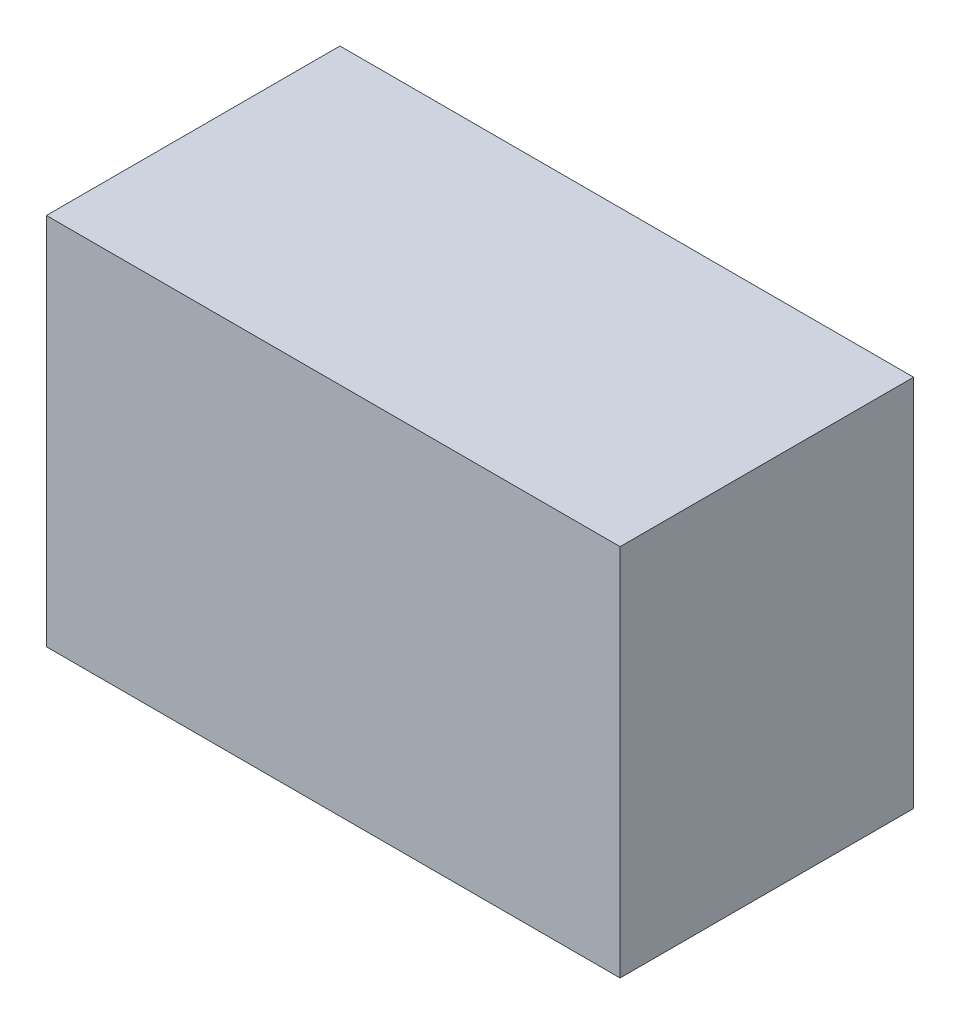
ISO-10303-21;
HEADER;
FILE_DESCRIPTION(('STEP AP214'),'2;1');
FILE_NAME('part.step','',(''),(''),'','','');
FILE_SCHEMA(('AUTOMOTIVE_DESIGN { 1 0 10303 214 1 1 1 1 }'));
ENDSEC;
DATA;
#1=APPLICATION_CONTEXT('core data for automotive mechanical design processes');
#2=APPLICATION_PROTOCOL_DEFINITION('international standard','automotive_design',2000,#1);
#3=PRODUCT_CONTEXT('',#1,'mechanical');
#4=PRODUCT('Part','Part','',(#3));
#5=PRODUCT_RELATED_PRODUCT_CATEGORY('part','',(#4));
#6=PRODUCT_DEFINITION_FORMATION('','',#4);
#7=PRODUCT_DEFINITION_CONTEXT('part definition',#1,'design');
#8=PRODUCT_DEFINITION('design','',#6,#7);
#9=PRODUCT_DEFINITION_SHAPE('','',#8);
#10=(LENGTH_UNIT() NAMED_UNIT(*) SI_UNIT(.MILLI.,.METRE.));
#11=(NAMED_UNIT(*) PLANE_ANGLE_UNIT() SI_UNIT($,.RADIAN.));
#12=(NAMED_UNIT(*) SI_UNIT($,.STERADIAN.) SOLID_ANGLE_UNIT());
#13=UNCERTAINTY_MEASURE_WITH_UNIT(LENGTH_MEASURE(1.E-05),#10,'distance_accuracy_value','');
#14=(GEOMETRIC_REPRESENTATION_CONTEXT(3) GLOBAL_UNCERTAINTY_ASSIGNED_CONTEXT((#13)) GLOBAL_UNIT_ASSIGNED_CONTEXT((#10,
#11,#12)) REPRESENTATION_CONTEXT('',''));
#15=CARTESIAN_POINT('',(0.,0.,0.));
#16=DIRECTION('',(0.,0.,1.));
#17=DIRECTION('',(1.,0.,0.));
#18=AXIS2_PLACEMENT_3D('',#15,#16,#17);
#19=CARTESIAN_POINT('',(-1.07499912,-0.6999986,1.10000034));
#20=DIRECTION('',(0.,0.,-1.));
#21=DIRECTION('',(-1.,0.,0.));
#22=AXIS2_PLACEMENT_3D('',#19,#20,#21);
#23=PLANE('',#22);
#24=DIRECTION('',(0.,1.,0.));
#25=VECTOR('',#24,1.);
#26=CARTESIAN_POINT('',(1.07500166,-0.6999986,1.10000034));
#27=LINE('',#26,#25);
#28=CARTESIAN_POINT('',(1.07500166,0.70000114,1.10000034));
#29=VERTEX_POINT('',#28);
#30=CARTESIAN_POINT('',(1.07500166,-0.6999986,1.10000034));
#31=VERTEX_POINT('',#30);
#32=EDGE_CURVE('E20',#29,#31,#27,.F.);
#33=ORIENTED_EDGE('',*,*,#32,.F.);
#34=DIRECTION('',(1.,0.,0.));
#35=VECTOR('',#34,1.);
#36=CARTESIAN_POINT('',(1.07500166,0.70000114,1.10000034));
#37=LINE('',#36,#35);
#38=CARTESIAN_POINT('',(-1.07499912,0.70000114,1.10000034));
#39=VERTEX_POINT('',#38);
#40=EDGE_CURVE('E55',#29,#39,#37,.F.);
#41=ORIENTED_EDGE('',*,*,#40,.T.);
#42=DIRECTION('',(0.,1.,0.));
#43=VECTOR('',#42,1.);
#44=CARTESIAN_POINT('',(-1.07499912,0.70000114,1.10000034));
#45=LINE('',#44,#43);
#46=CARTESIAN_POINT('',(-1.07499912,-0.6999986,1.10000034));
#47=VERTEX_POINT('',#46);
#48=EDGE_CURVE('E58',#39,#47,#45,.F.);
#49=ORIENTED_EDGE('',*,*,#48,.T.);
#50=DIRECTION('',(1.,0.,0.));
#51=VECTOR('',#50,1.);
#52=CARTESIAN_POINT('',(-1.07499912,-0.6999986,1.10000034));
#53=LINE('',#52,#51);
#54=EDGE_CURVE('E60',#47,#31,#53,.T.);
#55=ORIENTED_EDGE('',*,*,#54,.T.);
#56=EDGE_LOOP('',(#33,#41,#49,#55));
#57=FACE_BOUND('',#56,.T.);
#58=ADVANCED_FACE('F17',(#57),#23,.F.);
#59=CARTESIAN_POINT('',(-1.07499912,-0.6999986,0.));
#60=DIRECTION('',(0.,1.,0.));
#61=DIRECTION('',(0.,0.,1.));
#62=AXIS2_PLACEMENT_3D('',#59,#60,#61);
#63=PLANE('',#62);
#64=DIRECTION('',(-1.,0.,0.));
#65=VECTOR('',#64,1.);
#66=CARTESIAN_POINT('',(-1.07499912,-0.6999986,0.));
#67=LINE('',#66,#65);
#68=CARTESIAN_POINT('',(1.07500166,-0.6999986,0.));
#69=VERTEX_POINT('',#68);
#70=CARTESIAN_POINT('',(-1.07499912,-0.6999986,0.));
#71=VERTEX_POINT('',#70);
#72=EDGE_CURVE('E83',#69,#71,#67,.T.);
#73=ORIENTED_EDGE('',*,*,#72,.F.);
#74=DIRECTION('',(0.,0.,1.));
#75=VECTOR('',#74,1.);
#76=CARTESIAN_POINT('',(1.07500166,-0.6999986,0.));
#77=LINE('',#76,#75);
#78=EDGE_CURVE('E71',#69,#31,#77,.T.);
#79=ORIENTED_EDGE('',*,*,#78,.T.);
#80=ORIENTED_EDGE('',*,*,#54,.F.);
#81=DIRECTION('',(0.,0.,-1.));
#82=VECTOR('',#81,1.);
#83=CARTESIAN_POINT('',(-1.07499912,-0.6999986,0.));
#84=LINE('',#83,#82);
#85=EDGE_CURVE('E65',#47,#71,#84,.T.);
#86=ORIENTED_EDGE('',*,*,#85,.T.);
#87=EDGE_LOOP('',(#73,#79,#80,#86));
#88=FACE_BOUND('',#87,.T.);
#89=ADVANCED_FACE('F68',(#88),#63,.F.);
#90=CARTESIAN_POINT('',(-1.07499912,0.70000114,0.));
#91=DIRECTION('',(1.,0.,0.));
#92=DIRECTION('',(0.,0.,-1.));
#93=AXIS2_PLACEMENT_3D('',#90,#91,#92);
#94=PLANE('',#93);
#95=DIRECTION('',(0.,1.,0.));
#96=VECTOR('',#95,1.);
#97=CARTESIAN_POINT('',(-1.07499912,-0.6999986,0.));
#98=LINE('',#97,#96);
#99=CARTESIAN_POINT('',(-1.07499912,0.70000114,0.));
#100=VERTEX_POINT('',#99);
#101=EDGE_CURVE('E74',#71,#100,#98,.T.);
#102=ORIENTED_EDGE('',*,*,#101,.F.);
#103=ORIENTED_EDGE('',*,*,#85,.F.);
#104=ORIENTED_EDGE('',*,*,#48,.F.);
#105=DIRECTION('',(0.,0.,-1.));
#106=VECTOR('',#105,1.);
#107=CARTESIAN_POINT('',(-1.07499912,0.70000114,0.));
#108=LINE('',#107,#106);
#109=EDGE_CURVE('E77',#39,#100,#108,.T.);
#110=ORIENTED_EDGE('',*,*,#109,.T.);
#111=EDGE_LOOP('',(#102,#103,#104,#110));
#112=FACE_BOUND('',#111,.T.);
#113=ADVANCED_FACE('F72',(#112),#94,.F.);
#114=CARTESIAN_POINT('',(1.07500166,0.70000114,0.));
#115=DIRECTION('',(0.,-1.,0.));
#116=DIRECTION('',(0.,0.,-1.));
#117=AXIS2_PLACEMENT_3D('',#114,#115,#116);
#118=PLANE('',#117);
#119=DIRECTION('',(-1.,0.,0.));
#120=VECTOR('',#119,1.);
#121=CARTESIAN_POINT('',(-1.07499912,0.70000114,0.));
#122=LINE('',#121,#120);
#123=CARTESIAN_POINT('',(1.07500166,0.70000114,0.));
#124=VERTEX_POINT('',#123);
#125=EDGE_CURVE('E26',#100,#124,#122,.F.);
#126=ORIENTED_EDGE('',*,*,#125,.F.);
#127=ORIENTED_EDGE('',*,*,#109,.F.);
#128=ORIENTED_EDGE('',*,*,#40,.F.);
#129=DIRECTION('',(0.,0.,1.));
#130=VECTOR('',#129,1.);
#131=CARTESIAN_POINT('',(1.07500166,0.70000114,0.));
#132=LINE('',#131,#130);
#133=EDGE_CURVE('E35',#29,#124,#132,.F.);
#134=ORIENTED_EDGE('',*,*,#133,.T.);
#135=EDGE_LOOP('',(#126,#127,#128,#134));
#136=FACE_BOUND('',#135,.T.);
#137=ADVANCED_FACE('F89',(#136),#118,.F.);
#138=CARTESIAN_POINT('',(1.07500166,-0.6999986,0.));
#139=DIRECTION('',(-1.,0.,0.));
#140=DIRECTION('',(0.,0.,1.));
#141=AXIS2_PLACEMENT_3D('',#138,#139,#140);
#142=PLANE('',#141);
#143=DIRECTION('',(0.,1.,0.));
#144=VECTOR('',#143,1.);
#145=CARTESIAN_POINT('',(1.07500166,-0.6999986,0.));
#146=LINE('',#145,#144);
#147=EDGE_CURVE('E11',#124,#69,#146,.F.);
#148=ORIENTED_EDGE('',*,*,#147,.F.);
#149=ORIENTED_EDGE('',*,*,#133,.F.);
#150=ORIENTED_EDGE('',*,*,#32,.T.);
#151=ORIENTED_EDGE('',*,*,#78,.F.);
#152=EDGE_LOOP('',(#148,#149,#150,#151));
#153=FACE_BOUND('',#152,.T.);
#154=ADVANCED_FACE('F91',(#153),#142,.F.);
#155=CARTESIAN_POINT('',(-1.07499912,-0.6999986,0.));
#156=DIRECTION('',(0.,0.,-1.));
#157=DIRECTION('',(-1.,0.,0.));
#158=AXIS2_PLACEMENT_3D('',#155,#156,#157);
#159=PLANE('',#158);
#160=ORIENTED_EDGE('',*,*,#125,.T.);
#161=ORIENTED_EDGE('',*,*,#147,.T.);
#162=ORIENTED_EDGE('',*,*,#72,.T.);
#163=ORIENTED_EDGE('',*,*,#101,.T.);
#164=EDGE_LOOP('',(#160,#161,#162,#163));
#165=FACE_BOUND('',#164,.T.);
#166=ADVANCED_FACE('F88',(#165),#159,.T.);
#167=CLOSED_SHELL('',(#58,#89,#113,#137,#154,#166));
#168=MANIFOLD_SOLID_BREP('B1',#167);
#169=ADVANCED_BREP_SHAPE_REPRESENTATION('',(#18,#168),#14);
#170=SHAPE_DEFINITION_REPRESENTATION(#9,#169);
ENDSEC;
END-ISO-10303-21;
